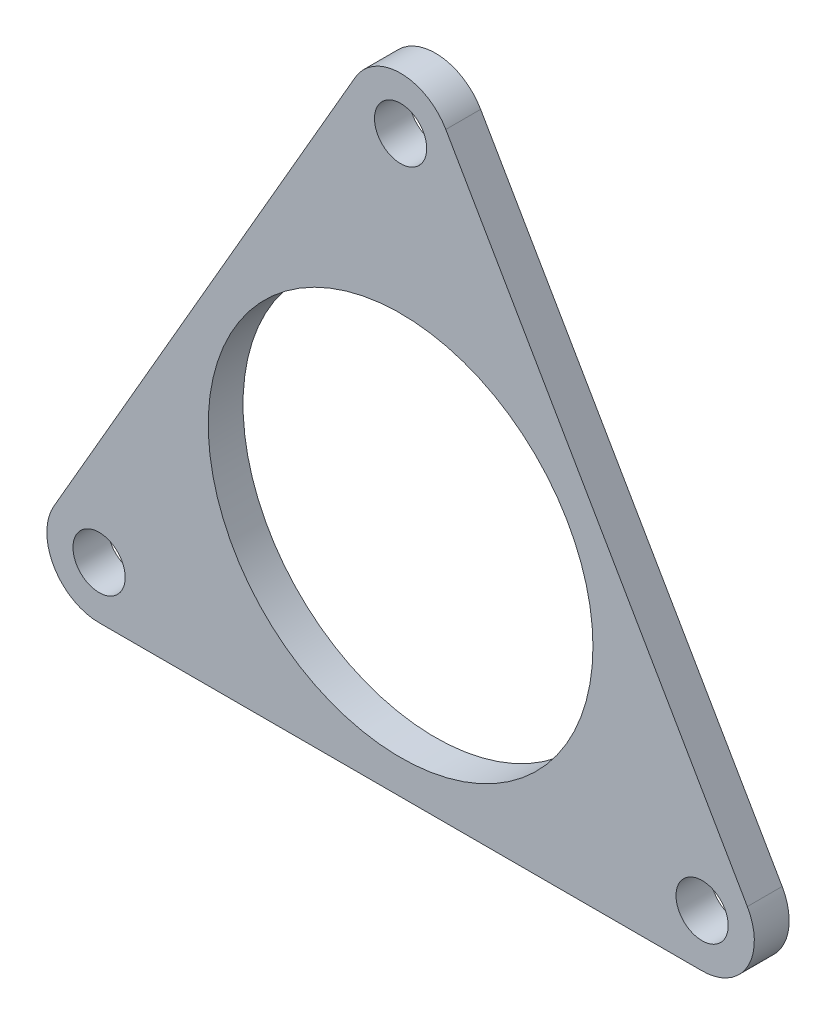
ISO-10303-21;
HEADER;
FILE_DESCRIPTION(('STEP AP214'),'2;1');
FILE_NAME('part.step','',(''),(''),'','','');
FILE_SCHEMA(('AUTOMOTIVE_DESIGN { 1 0 10303 214 1 1 1 1 }'));
ENDSEC;
DATA;
#1=APPLICATION_CONTEXT('core data for automotive mechanical design processes');
#2=APPLICATION_PROTOCOL_DEFINITION('international standard','automotive_design',2000,#1);
#3=PRODUCT_CONTEXT('',#1,'mechanical');
#4=PRODUCT('Part','Part','',(#3));
#5=PRODUCT_RELATED_PRODUCT_CATEGORY('part','',(#4));
#6=PRODUCT_DEFINITION_FORMATION('','',#4);
#7=PRODUCT_DEFINITION_CONTEXT('part definition',#1,'design');
#8=PRODUCT_DEFINITION('design','',#6,#7);
#9=PRODUCT_DEFINITION_SHAPE('','',#8);
#10=(LENGTH_UNIT() NAMED_UNIT(*) SI_UNIT(.MILLI.,.METRE.));
#11=(NAMED_UNIT(*) PLANE_ANGLE_UNIT() SI_UNIT($,.RADIAN.));
#12=(NAMED_UNIT(*) SI_UNIT($,.STERADIAN.) SOLID_ANGLE_UNIT());
#13=UNCERTAINTY_MEASURE_WITH_UNIT(LENGTH_MEASURE(1.E-05),#10,'distance_accuracy_value','');
#14=(GEOMETRIC_REPRESENTATION_CONTEXT(3) GLOBAL_UNCERTAINTY_ASSIGNED_CONTEXT((#13)) GLOBAL_UNIT_ASSIGNED_CONTEXT((#10,
#11,#12)) REPRESENTATION_CONTEXT('',''));
#15=CARTESIAN_POINT('',(0.,0.,0.));
#16=DIRECTION('',(0.,0.,1.));
#17=DIRECTION('',(1.,0.,0.));
#18=AXIS2_PLACEMENT_3D('',#15,#16,#17);
#19=CARTESIAN_POINT('',(-17.3205080756888,-9.99999999999999,2.));
#20=DIRECTION('',(0.,0.,1.));
#21=DIRECTION('',(1.,0.,0.));
#22=AXIS2_PLACEMENT_3D('',#19,#20,#21);
#23=PLANE('',#22);
#24=CARTESIAN_POINT('',(17.3205080756888,-10.,2.));
#25=DIRECTION('',(0.,0.,1.));
#26=DIRECTION('',(1.,0.,0.));
#27=AXIS2_PLACEMENT_3D('',#24,#25,#26);
#28=CIRCLE('',#27,1.5);
#29=CARTESIAN_POINT('',(18.8205080756888,-10.,2.));
#30=VERTEX_POINT('',#29);
#31=EDGE_CURVE('E192',#30,#30,#28,.T.);
#32=ORIENTED_EDGE('',*,*,#31,.F.);
#33=EDGE_LOOP('',(#32));
#34=FACE_BOUND('',#33,.T.);
#35=CARTESIAN_POINT('',(-17.3205080756888,-10.,2.));
#36=DIRECTION('',(0.,0.,1.));
#37=DIRECTION('',(1.,0.,0.));
#38=AXIS2_PLACEMENT_3D('',#35,#36,#37);
#39=CIRCLE('',#38,1.5);
#40=CARTESIAN_POINT('',(-15.8205080756888,-10.,2.));
#41=VERTEX_POINT('',#40);
#42=EDGE_CURVE('E125',#41,#41,#39,.T.);
#43=ORIENTED_EDGE('',*,*,#42,.F.);
#44=EDGE_LOOP('',(#43));
#45=FACE_BOUND('',#44,.T.);
#46=CARTESIAN_POINT('',(-17.3205080756888,-9.99999999999999,2.));
#47=DIRECTION('',(0.,0.,1.));
#48=DIRECTION('',(1.,0.,0.));
#49=AXIS2_PLACEMENT_3D('',#46,#47,#48);
#50=CIRCLE('',#49,3.);
#51=CARTESIAN_POINT('',(-19.9185842870421,-8.49999999999999,2.));
#52=VERTEX_POINT('',#51);
#53=CARTESIAN_POINT('',(-17.3205080756888,-13.,2.));
#54=VERTEX_POINT('',#53);
#55=EDGE_CURVE('E132',#52,#54,#50,.T.);
#56=ORIENTED_EDGE('',*,*,#55,.T.);
#57=DIRECTION('',(1.,0.,0.));
#58=VECTOR('',#57,1.);
#59=CARTESIAN_POINT('',(-17.3205080756888,-13.,2.));
#60=LINE('',#59,#58);
#61=CARTESIAN_POINT('',(17.3205080756888,-13.,2.));
#62=VERTEX_POINT('',#61);
#63=EDGE_CURVE('E90',#54,#62,#60,.T.);
#64=ORIENTED_EDGE('',*,*,#63,.T.);
#65=CARTESIAN_POINT('',(17.3205080756888,-9.99999999999999,2.));
#66=DIRECTION('',(0.,0.,1.));
#67=DIRECTION('',(1.,0.,0.));
#68=AXIS2_PLACEMENT_3D('',#65,#66,#67);
#69=CIRCLE('',#68,3.);
#70=CARTESIAN_POINT('',(19.9185842870421,-8.49999999999999,2.));
#71=VERTEX_POINT('',#70);
#72=EDGE_CURVE('E103',#62,#71,#69,.T.);
#73=ORIENTED_EDGE('',*,*,#72,.T.);
#74=DIRECTION('',(-0.5,0.866025403784439,0.));
#75=VECTOR('',#74,1.);
#76=CARTESIAN_POINT('',(19.9185842870421,-8.49999999999999,2.));
#77=LINE('',#76,#75);
#78=CARTESIAN_POINT('',(2.59807621135331,21.5,2.));
#79=VERTEX_POINT('',#78);
#80=EDGE_CURVE('E97',#71,#79,#77,.T.);
#81=ORIENTED_EDGE('',*,*,#80,.T.);
#82=CARTESIAN_POINT('',(0.,20.,2.));
#83=DIRECTION('',(0.,0.,1.));
#84=DIRECTION('',(-1.,0.,0.));
#85=AXIS2_PLACEMENT_3D('',#82,#83,#84);
#86=CIRCLE('',#85,3.);
#87=CARTESIAN_POINT('',(-2.59807621135331,21.5,2.));
#88=VERTEX_POINT('',#87);
#89=EDGE_CURVE('E101',#79,#88,#86,.T.);
#90=ORIENTED_EDGE('',*,*,#89,.T.);
#91=DIRECTION('',(-0.5,-0.866025403784439,0.));
#92=VECTOR('',#91,1.);
#93=CARTESIAN_POINT('',(-2.59807621135331,21.5,2.));
#94=LINE('',#93,#92);
#95=EDGE_CURVE('E53',#88,#52,#94,.T.);
#96=ORIENTED_EDGE('',*,*,#95,.T.);
#97=EDGE_LOOP('',(#56,#64,#73,#81,#90,#96));
#98=FACE_BOUND('',#97,.T.);
#99=CARTESIAN_POINT('',(0.,20.,2.));
#100=DIRECTION('',(0.,0.,1.));
#101=DIRECTION('',(1.,0.,0.));
#102=AXIS2_PLACEMENT_3D('',#99,#100,#101);
#103=CIRCLE('',#102,1.5);
#104=CARTESIAN_POINT('',(1.5,20.,2.));
#105=VERTEX_POINT('',#104);
#106=EDGE_CURVE('E198',#105,#105,#103,.T.);
#107=ORIENTED_EDGE('',*,*,#106,.F.);
#108=EDGE_LOOP('',(#107));
#109=FACE_BOUND('',#108,.T.);
#110=CARTESIAN_POINT('',(0.,0.,2.));
#111=DIRECTION('',(0.,0.,1.));
#112=DIRECTION('',(1.,0.,0.));
#113=AXIS2_PLACEMENT_3D('',#110,#111,#112);
#114=CIRCLE('',#113,11.05);
#115=CARTESIAN_POINT('',(11.05,0.,2.));
#116=VERTEX_POINT('',#115);
#117=EDGE_CURVE('E183',#116,#116,#114,.T.);
#118=ORIENTED_EDGE('',*,*,#117,.F.);
#119=EDGE_LOOP('',(#118));
#120=FACE_BOUND('',#119,.T.);
#121=ADVANCED_FACE('F36',(#34,#45,#98,#109,#120),#23,.T.);
#122=CARTESIAN_POINT('',(-17.3205080756888,-9.99999999999999,0.));
#123=DIRECTION('',(0.,0.,1.));
#124=DIRECTION('',(1.,0.,0.));
#125=AXIS2_PLACEMENT_3D('',#122,#123,#124);
#126=PLANE('',#125);
#127=CARTESIAN_POINT('',(-17.3205080756888,-9.99999999999999,0.));
#128=DIRECTION('',(0.,0.,1.));
#129=DIRECTION('',(1.,0.,0.));
#130=AXIS2_PLACEMENT_3D('',#127,#128,#129);
#131=CIRCLE('',#130,3.);
#132=CARTESIAN_POINT('',(-19.9185842870421,-8.49999999999999,0.));
#133=VERTEX_POINT('',#132);
#134=CARTESIAN_POINT('',(-17.3205080756888,-13.,0.));
#135=VERTEX_POINT('',#134);
#136=EDGE_CURVE('E121',#133,#135,#131,.T.);
#137=ORIENTED_EDGE('',*,*,#136,.F.);
#138=DIRECTION('',(-0.5,-0.866025403784439,0.));
#139=VECTOR('',#138,1.);
#140=CARTESIAN_POINT('',(-2.59807621135331,21.5,0.));
#141=LINE('',#140,#139);
#142=CARTESIAN_POINT('',(-2.59807621135331,21.5,0.));
#143=VERTEX_POINT('',#142);
#144=EDGE_CURVE('E82',#143,#133,#141,.T.);
#145=ORIENTED_EDGE('',*,*,#144,.F.);
#146=CARTESIAN_POINT('',(0.,20.,0.));
#147=DIRECTION('',(0.,0.,1.));
#148=DIRECTION('',(-1.,0.,0.));
#149=AXIS2_PLACEMENT_3D('',#146,#147,#148);
#150=CIRCLE('',#149,3.);
#151=CARTESIAN_POINT('',(2.59807621135331,21.5,0.));
#152=VERTEX_POINT('',#151);
#153=EDGE_CURVE('E76',#152,#143,#150,.T.);
#154=ORIENTED_EDGE('',*,*,#153,.F.);
#155=DIRECTION('',(-0.5,0.866025403784439,0.));
#156=VECTOR('',#155,1.);
#157=CARTESIAN_POINT('',(19.9185842870421,-8.49999999999999,0.));
#158=LINE('',#157,#156);
#159=CARTESIAN_POINT('',(19.9185842870421,-8.49999999999999,0.));
#160=VERTEX_POINT('',#159);
#161=EDGE_CURVE('E111',#160,#152,#158,.T.);
#162=ORIENTED_EDGE('',*,*,#161,.F.);
#163=CARTESIAN_POINT('',(17.3205080756888,-9.99999999999999,0.));
#164=DIRECTION('',(0.,0.,1.));
#165=DIRECTION('',(1.,0.,0.));
#166=AXIS2_PLACEMENT_3D('',#163,#164,#165);
#167=CIRCLE('',#166,3.);
#168=CARTESIAN_POINT('',(17.3205080756888,-13.,0.));
#169=VERTEX_POINT('',#168);
#170=EDGE_CURVE('E127',#169,#160,#167,.T.);
#171=ORIENTED_EDGE('',*,*,#170,.F.);
#172=DIRECTION('',(1.,0.,0.));
#173=VECTOR('',#172,1.);
#174=CARTESIAN_POINT('',(-17.3205080756888,-13.,0.));
#175=LINE('',#174,#173);
#176=EDGE_CURVE('E124',#135,#169,#175,.T.);
#177=ORIENTED_EDGE('',*,*,#176,.F.);
#178=EDGE_LOOP('',(#137,#145,#154,#162,#171,#177));
#179=FACE_BOUND('',#178,.T.);
#180=CARTESIAN_POINT('',(-17.3205080756888,-10.,0.));
#181=DIRECTION('',(0.,0.,1.));
#182=DIRECTION('',(1.,0.,0.));
#183=AXIS2_PLACEMENT_3D('',#180,#181,#182);
#184=CIRCLE('',#183,1.5);
#185=CARTESIAN_POINT('',(-15.8205080756888,-10.,0.));
#186=VERTEX_POINT('',#185);
#187=EDGE_CURVE('E201',#186,#186,#184,.T.);
#188=ORIENTED_EDGE('',*,*,#187,.T.);
#189=EDGE_LOOP('',(#188));
#190=FACE_BOUND('',#189,.T.);
#191=CARTESIAN_POINT('',(0.,20.,0.));
#192=DIRECTION('',(0.,0.,1.));
#193=DIRECTION('',(1.,0.,0.));
#194=AXIS2_PLACEMENT_3D('',#191,#192,#193);
#195=CIRCLE('',#194,1.5);
#196=CARTESIAN_POINT('',(1.5,20.,0.));
#197=VERTEX_POINT('',#196);
#198=EDGE_CURVE('E195',#197,#197,#195,.T.);
#199=ORIENTED_EDGE('',*,*,#198,.T.);
#200=EDGE_LOOP('',(#199));
#201=FACE_BOUND('',#200,.T.);
#202=CARTESIAN_POINT('',(17.3205080756888,-10.,0.));
#203=DIRECTION('',(0.,0.,1.));
#204=DIRECTION('',(1.,0.,0.));
#205=AXIS2_PLACEMENT_3D('',#202,#203,#204);
#206=CIRCLE('',#205,1.5);
#207=CARTESIAN_POINT('',(18.8205080756888,-10.,0.));
#208=VERTEX_POINT('',#207);
#209=EDGE_CURVE('E189',#208,#208,#206,.T.);
#210=ORIENTED_EDGE('',*,*,#209,.T.);
#211=EDGE_LOOP('',(#210));
#212=FACE_BOUND('',#211,.T.);
#213=CARTESIAN_POINT('',(0.,0.,0.));
#214=DIRECTION('',(0.,0.,1.));
#215=DIRECTION('',(1.,0.,0.));
#216=AXIS2_PLACEMENT_3D('',#213,#214,#215);
#217=CIRCLE('',#216,11.05);
#218=CARTESIAN_POINT('',(11.05,0.,0.));
#219=VERTEX_POINT('',#218);
#220=EDGE_CURVE('E186',#219,#219,#217,.T.);
#221=ORIENTED_EDGE('',*,*,#220,.T.);
#222=EDGE_LOOP('',(#221));
#223=FACE_BOUND('',#222,.T.);
#224=ADVANCED_FACE('F141',(#179,#190,#201,#212,#223),#126,.F.);
#225=CARTESIAN_POINT('',(-17.3205080756888,-9.99999999999999,2.));
#226=DIRECTION('',(0.,0.,-1.));
#227=DIRECTION('',(-1.,0.,0.));
#228=AXIS2_PLACEMENT_3D('',#225,#226,#227);
#229=CYLINDRICAL_SURFACE('',#228,3.);
#230=ORIENTED_EDGE('',*,*,#136,.T.);
#231=DIRECTION('',(0.,0.,-1.));
#232=VECTOR('',#231,1.);
#233=CARTESIAN_POINT('',(-17.3205080756888,-13.,2.));
#234=LINE('',#233,#232);
#235=EDGE_CURVE('E11',#54,#135,#234,.T.);
#236=ORIENTED_EDGE('',*,*,#235,.F.);
#237=ORIENTED_EDGE('',*,*,#55,.F.);
#238=DIRECTION('',(0.,0.,-1.));
#239=VECTOR('',#238,1.);
#240=CARTESIAN_POINT('',(-19.9185842870421,-8.49999999999999,2.));
#241=LINE('',#240,#239);
#242=EDGE_CURVE('E117',#52,#133,#241,.T.);
#243=ORIENTED_EDGE('',*,*,#242,.T.);
#244=EDGE_LOOP('',(#230,#236,#237,#243));
#245=FACE_BOUND('',#244,.T.);
#246=ADVANCED_FACE('F38',(#245),#229,.T.);
#247=CARTESIAN_POINT('',(-17.3205080756888,-13.,2.));
#248=DIRECTION('',(0.,1.,0.));
#249=DIRECTION('',(0.,0.,1.));
#250=AXIS2_PLACEMENT_3D('',#247,#248,#249);
#251=PLANE('',#250);
#252=ORIENTED_EDGE('',*,*,#176,.T.);
#253=DIRECTION('',(0.,0.,-1.));
#254=VECTOR('',#253,1.);
#255=CARTESIAN_POINT('',(17.3205080756888,-13.,2.));
#256=LINE('',#255,#254);
#257=EDGE_CURVE('E45',#62,#169,#256,.T.);
#258=ORIENTED_EDGE('',*,*,#257,.F.);
#259=ORIENTED_EDGE('',*,*,#63,.F.);
#260=ORIENTED_EDGE('',*,*,#235,.T.);
#261=EDGE_LOOP('',(#252,#258,#259,#260));
#262=FACE_BOUND('',#261,.T.);
#263=ADVANCED_FACE('F259',(#262),#251,.F.);
#264=CARTESIAN_POINT('',(17.3205080756888,-9.99999999999999,2.));
#265=DIRECTION('',(0.,0.,-1.));
#266=DIRECTION('',(-1.,0.,0.));
#267=AXIS2_PLACEMENT_3D('',#264,#265,#266);
#268=CYLINDRICAL_SURFACE('',#267,3.);
#269=ORIENTED_EDGE('',*,*,#170,.T.);
#270=DIRECTION('',(0.,0.,-1.));
#271=VECTOR('',#270,1.);
#272=CARTESIAN_POINT('',(19.9185842870421,-8.49999999999999,2.));
#273=LINE('',#272,#271);
#274=EDGE_CURVE('E112',#71,#160,#273,.T.);
#275=ORIENTED_EDGE('',*,*,#274,.F.);
#276=ORIENTED_EDGE('',*,*,#72,.F.);
#277=ORIENTED_EDGE('',*,*,#257,.T.);
#278=EDGE_LOOP('',(#269,#275,#276,#277));
#279=FACE_BOUND('',#278,.T.);
#280=ADVANCED_FACE('F138',(#279),#268,.T.);
#281=CARTESIAN_POINT('',(19.9185842870421,-8.49999999999999,2.));
#282=DIRECTION('',(-0.866025403784439,-0.5,0.));
#283=DIRECTION('',(0.5,-0.866025403784439,0.));
#284=AXIS2_PLACEMENT_3D('',#281,#282,#283);
#285=PLANE('',#284);
#286=ORIENTED_EDGE('',*,*,#161,.T.);
#287=DIRECTION('',(0.,0.,-1.));
#288=VECTOR('',#287,1.);
#289=CARTESIAN_POINT('',(2.59807621135331,21.5,2.));
#290=LINE('',#289,#288);
#291=EDGE_CURVE('E108',#79,#152,#290,.T.);
#292=ORIENTED_EDGE('',*,*,#291,.F.);
#293=ORIENTED_EDGE('',*,*,#80,.F.);
#294=ORIENTED_EDGE('',*,*,#274,.T.);
#295=EDGE_LOOP('',(#286,#292,#293,#294));
#296=FACE_BOUND('',#295,.T.);
#297=ADVANCED_FACE('F109',(#296),#285,.F.);
#298=CARTESIAN_POINT('',(0.,20.,2.));
#299=DIRECTION('',(0.,0.,-1.));
#300=DIRECTION('',(-1.,0.,0.));
#301=AXIS2_PLACEMENT_3D('',#298,#299,#300);
#302=CYLINDRICAL_SURFACE('',#301,3.);
#303=ORIENTED_EDGE('',*,*,#153,.T.);
#304=DIRECTION('',(0.,0.,-1.));
#305=VECTOR('',#304,1.);
#306=CARTESIAN_POINT('',(-2.59807621135331,21.5,2.));
#307=LINE('',#306,#305);
#308=EDGE_CURVE('E113',#88,#143,#307,.T.);
#309=ORIENTED_EDGE('',*,*,#308,.F.);
#310=ORIENTED_EDGE('',*,*,#89,.F.);
#311=ORIENTED_EDGE('',*,*,#291,.T.);
#312=EDGE_LOOP('',(#303,#309,#310,#311));
#313=FACE_BOUND('',#312,.T.);
#314=ADVANCED_FACE('F115',(#313),#302,.T.);
#315=CARTESIAN_POINT('',(-2.59807621135331,21.5,2.));
#316=DIRECTION('',(0.866025403784439,-0.5,0.));
#317=DIRECTION('',(0.5,0.866025403784439,0.));
#318=AXIS2_PLACEMENT_3D('',#315,#316,#317);
#319=PLANE('',#318);
#320=ORIENTED_EDGE('',*,*,#144,.T.);
#321=ORIENTED_EDGE('',*,*,#242,.F.);
#322=ORIENTED_EDGE('',*,*,#95,.F.);
#323=ORIENTED_EDGE('',*,*,#308,.T.);
#324=EDGE_LOOP('',(#320,#321,#322,#323));
#325=FACE_BOUND('',#324,.T.);
#326=ADVANCED_FACE('F146',(#325),#319,.F.);
#327=CARTESIAN_POINT('',(-17.3205080756888,-10.,2.));
#328=DIRECTION('',(0.,0.,-1.));
#329=DIRECTION('',(-1.,0.,0.));
#330=AXIS2_PLACEMENT_3D('',#327,#328,#329);
#331=CYLINDRICAL_SURFACE('',#330,1.5);
#332=ORIENTED_EDGE('',*,*,#42,.T.);
#333=EDGE_LOOP('',(#332));
#334=FACE_BOUND('',#333,.T.);
#335=ORIENTED_EDGE('',*,*,#187,.F.);
#336=EDGE_LOOP('',(#335));
#337=FACE_BOUND('',#336,.T.);
#338=ADVANCED_FACE('F148',(#334,#337),#331,.F.);
#339=CARTESIAN_POINT('',(0.,20.,2.));
#340=DIRECTION('',(0.,0.,-1.));
#341=DIRECTION('',(-1.,0.,0.));
#342=AXIS2_PLACEMENT_3D('',#339,#340,#341);
#343=CYLINDRICAL_SURFACE('',#342,1.5);
#344=ORIENTED_EDGE('',*,*,#106,.T.);
#345=EDGE_LOOP('',(#344));
#346=FACE_BOUND('',#345,.T.);
#347=ORIENTED_EDGE('',*,*,#198,.F.);
#348=EDGE_LOOP('',(#347));
#349=FACE_BOUND('',#348,.T.);
#350=ADVANCED_FACE('F154',(#346,#349),#343,.F.);
#351=CARTESIAN_POINT('',(17.3205080756888,-10.,2.));
#352=DIRECTION('',(0.,0.,-1.));
#353=DIRECTION('',(-1.,0.,0.));
#354=AXIS2_PLACEMENT_3D('',#351,#352,#353);
#355=CYLINDRICAL_SURFACE('',#354,1.5);
#356=ORIENTED_EDGE('',*,*,#31,.T.);
#357=EDGE_LOOP('',(#356));
#358=FACE_BOUND('',#357,.T.);
#359=ORIENTED_EDGE('',*,*,#209,.F.);
#360=EDGE_LOOP('',(#359));
#361=FACE_BOUND('',#360,.T.);
#362=ADVANCED_FACE('F170',(#358,#361),#355,.F.);
#363=CARTESIAN_POINT('',(0.,0.,2.));
#364=DIRECTION('',(0.,0.,-1.));
#365=DIRECTION('',(-1.,0.,0.));
#366=AXIS2_PLACEMENT_3D('',#363,#364,#365);
#367=CYLINDRICAL_SURFACE('',#366,11.05);
#368=ORIENTED_EDGE('',*,*,#117,.T.);
#369=EDGE_LOOP('',(#368));
#370=FACE_BOUND('',#369,.T.);
#371=ORIENTED_EDGE('',*,*,#220,.F.);
#372=EDGE_LOOP('',(#371));
#373=FACE_BOUND('',#372,.T.);
#374=ADVANCED_FACE('F174',(#370,#373),#367,.F.);
#375=CLOSED_SHELL('',(#121,#224,#246,#263,#280,#297,#314,#326,#338,#350,#362,#374));
#376=MANIFOLD_SOLID_BREP('B2',#375);
#377=ADVANCED_BREP_SHAPE_REPRESENTATION('',(#18,#376),#14);
#378=SHAPE_DEFINITION_REPRESENTATION(#9,#377);
ENDSEC;
END-ISO-10303-21;
